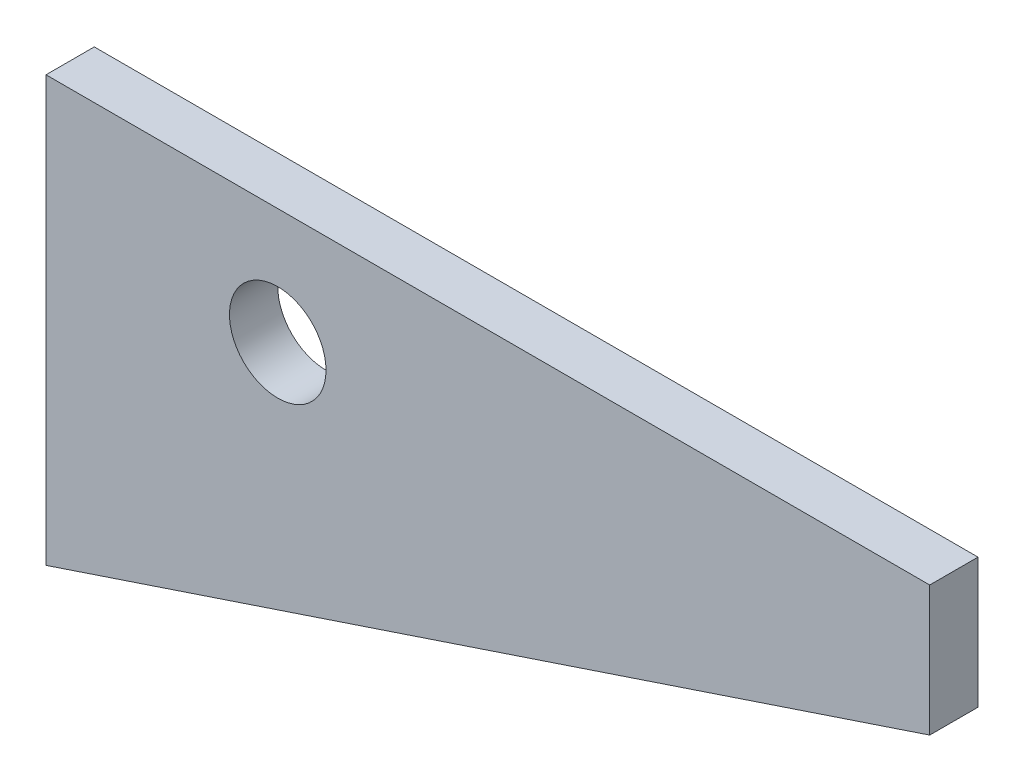
ISO-10303-21;
HEADER;
FILE_DESCRIPTION(('STEP AP214'),'2;1');
FILE_NAME('part.step','',(''),(''),'','','');
FILE_SCHEMA(('AUTOMOTIVE_DESIGN { 1 0 10303 214 1 1 1 1 }'));
ENDSEC;
DATA;
#1=APPLICATION_CONTEXT('core data for automotive mechanical design processes');
#2=APPLICATION_PROTOCOL_DEFINITION('international standard','automotive_design',2000,#1);
#3=PRODUCT_CONTEXT('',#1,'mechanical');
#4=PRODUCT('Part','Part','',(#3));
#5=PRODUCT_RELATED_PRODUCT_CATEGORY('part','',(#4));
#6=PRODUCT_DEFINITION_FORMATION('','',#4);
#7=PRODUCT_DEFINITION_CONTEXT('part definition',#1,'design');
#8=PRODUCT_DEFINITION('design','',#6,#7);
#9=PRODUCT_DEFINITION_SHAPE('','',#8);
#10=(LENGTH_UNIT() NAMED_UNIT(*) SI_UNIT(.MILLI.,.METRE.));
#11=(NAMED_UNIT(*) PLANE_ANGLE_UNIT() SI_UNIT($,.RADIAN.));
#12=(NAMED_UNIT(*) SI_UNIT($,.STERADIAN.) SOLID_ANGLE_UNIT());
#13=UNCERTAINTY_MEASURE_WITH_UNIT(LENGTH_MEASURE(1.E-05),#10,'distance_accuracy_value','');
#14=(GEOMETRIC_REPRESENTATION_CONTEXT(3) GLOBAL_UNCERTAINTY_ASSIGNED_CONTEXT((#13)) GLOBAL_UNIT_ASSIGNED_CONTEXT((#10,
#11,#12)) REPRESENTATION_CONTEXT('',''));
#15=CARTESIAN_POINT('',(0.,0.,0.));
#16=DIRECTION('',(0.,0.,1.));
#17=DIRECTION('',(1.,0.,0.));
#18=AXIS2_PLACEMENT_3D('',#15,#16,#17);
#19=CARTESIAN_POINT('',(0.,0.,7.9375));
#20=DIRECTION('',(0.,0.,-1.));
#21=DIRECTION('',(-1.,0.,0.));
#22=AXIS2_PLACEMENT_3D('',#19,#20,#21);
#23=PLANE('',#22);
#24=DIRECTION('',(0.,-1.,0.));
#25=VECTOR('',#24,1.);
#26=CARTESIAN_POINT('',(0.,-69.85,7.9375));
#27=LINE('',#26,#25);
#28=CARTESIAN_POINT('',(0.,0.,7.9375));
#29=VERTEX_POINT('',#28);
#30=CARTESIAN_POINT('',(0.,-69.85,7.9375));
#31=VERTEX_POINT('',#30);
#32=EDGE_CURVE('E92',#29,#31,#27,.T.);
#33=ORIENTED_EDGE('',*,*,#32,.T.);
#34=DIRECTION('',(0.948590381426202,0.31650637950236,0.));
#35=VECTOR('',#34,1.);
#36=CARTESIAN_POINT('',(145.288,-21.3732499026595,7.9375));
#37=LINE('',#36,#35);
#38=CARTESIAN_POINT('',(145.288,-21.3732499026595,7.9375));
#39=VERTEX_POINT('',#38);
#40=EDGE_CURVE('E87',#31,#39,#37,.T.);
#41=ORIENTED_EDGE('',*,*,#40,.T.);
#42=DIRECTION('',(0.,1.,0.));
#43=VECTOR('',#42,1.);
#44=CARTESIAN_POINT('',(145.288,0.,7.9375));
#45=LINE('',#44,#43);
#46=CARTESIAN_POINT('',(145.288,0.,7.9375));
#47=VERTEX_POINT('',#46);
#48=EDGE_CURVE('E90',#39,#47,#45,.T.);
#49=ORIENTED_EDGE('',*,*,#48,.T.);
#50=DIRECTION('',(-1.,0.,0.));
#51=VECTOR('',#50,1.);
#52=CARTESIAN_POINT('',(0.,0.,7.9375));
#53=LINE('',#52,#51);
#54=EDGE_CURVE('E57',#47,#29,#53,.T.);
#55=ORIENTED_EDGE('',*,*,#54,.T.);
#56=EDGE_LOOP('',(#33,#41,#49,#55));
#57=FACE_BOUND('',#56,.T.);
#58=CARTESIAN_POINT('',(38.1,-19.05,7.9375));
#59=DIRECTION('',(0.,0.,1.));
#60=DIRECTION('',(1.,0.,0.));
#61=AXIS2_PLACEMENT_3D('',#58,#59,#60);
#62=CIRCLE('',#61,7.9375);
#63=CARTESIAN_POINT('',(46.0375,-19.05,7.9375));
#64=VERTEX_POINT('',#63);
#65=EDGE_CURVE('E112',#64,#64,#62,.T.);
#66=ORIENTED_EDGE('',*,*,#65,.F.);
#67=EDGE_LOOP('',(#66));
#68=FACE_BOUND('',#67,.T.);
#69=ADVANCED_FACE('F39',(#57,#68),#23,.F.);
#70=CARTESIAN_POINT('',(0.,0.,0.));
#71=DIRECTION('',(0.,0.,-1.));
#72=DIRECTION('',(-1.,0.,0.));
#73=AXIS2_PLACEMENT_3D('',#70,#71,#72);
#74=PLANE('',#73);
#75=DIRECTION('',(0.,-1.,0.));
#76=VECTOR('',#75,1.);
#77=CARTESIAN_POINT('',(0.,-69.85,0.));
#78=LINE('',#77,#76);
#79=CARTESIAN_POINT('',(0.,0.,0.));
#80=VERTEX_POINT('',#79);
#81=CARTESIAN_POINT('',(0.,-69.85,0.));
#82=VERTEX_POINT('',#81);
#83=EDGE_CURVE('E108',#80,#82,#78,.T.);
#84=ORIENTED_EDGE('',*,*,#83,.F.);
#85=DIRECTION('',(-1.,0.,0.));
#86=VECTOR('',#85,1.);
#87=CARTESIAN_POINT('',(0.,0.,0.));
#88=LINE('',#87,#86);
#89=CARTESIAN_POINT('',(145.288,0.,0.));
#90=VERTEX_POINT('',#89);
#91=EDGE_CURVE('E80',#90,#80,#88,.T.);
#92=ORIENTED_EDGE('',*,*,#91,.F.);
#93=DIRECTION('',(0.,1.,0.));
#94=VECTOR('',#93,1.);
#95=CARTESIAN_POINT('',(145.288,0.,0.));
#96=LINE('',#95,#94);
#97=CARTESIAN_POINT('',(145.288,-21.3732499026595,0.));
#98=VERTEX_POINT('',#97);
#99=EDGE_CURVE('E74',#98,#90,#96,.T.);
#100=ORIENTED_EDGE('',*,*,#99,.F.);
#101=DIRECTION('',(0.948590381426202,0.31650637950236,0.));
#102=VECTOR('',#101,1.);
#103=CARTESIAN_POINT('',(145.288,-21.3732499026595,0.));
#104=LINE('',#103,#102);
#105=EDGE_CURVE('E97',#82,#98,#104,.T.);
#106=ORIENTED_EDGE('',*,*,#105,.F.);
#107=EDGE_LOOP('',(#84,#92,#100,#106));
#108=FACE_BOUND('',#107,.T.);
#109=CARTESIAN_POINT('',(38.1,-19.05,0.));
#110=DIRECTION('',(0.,0.,1.));
#111=DIRECTION('',(1.,0.,0.));
#112=AXIS2_PLACEMENT_3D('',#109,#110,#111);
#113=CIRCLE('',#112,7.9375);
#114=CARTESIAN_POINT('',(46.0375,-19.05,0.));
#115=VERTEX_POINT('',#114);
#116=EDGE_CURVE('E130',#115,#115,#113,.T.);
#117=ORIENTED_EDGE('',*,*,#116,.T.);
#118=EDGE_LOOP('',(#117));
#119=FACE_BOUND('',#118,.T.);
#120=ADVANCED_FACE('F125',(#108,#119),#74,.T.);
#121=CARTESIAN_POINT('',(0.,-69.85,7.9375));
#122=DIRECTION('',(1.,0.,0.));
#123=DIRECTION('',(0.,0.,-1.));
#124=AXIS2_PLACEMENT_3D('',#121,#122,#123);
#125=PLANE('',#124);
#126=ORIENTED_EDGE('',*,*,#83,.T.);
#127=DIRECTION('',(0.,0.,-1.));
#128=VECTOR('',#127,1.);
#129=CARTESIAN_POINT('',(0.,-69.85,7.9375));
#130=LINE('',#129,#128);
#131=EDGE_CURVE('E11',#31,#82,#130,.T.);
#132=ORIENTED_EDGE('',*,*,#131,.F.);
#133=ORIENTED_EDGE('',*,*,#32,.F.);
#134=DIRECTION('',(0.,0.,-1.));
#135=VECTOR('',#134,1.);
#136=CARTESIAN_POINT('',(0.,0.,7.9375));
#137=LINE('',#136,#135);
#138=EDGE_CURVE('E104',#29,#80,#137,.T.);
#139=ORIENTED_EDGE('',*,*,#138,.T.);
#140=EDGE_LOOP('',(#126,#132,#133,#139));
#141=FACE_BOUND('',#140,.T.);
#142=ADVANCED_FACE('F41',(#141),#125,.F.);
#143=CARTESIAN_POINT('',(145.288,-21.3732499026595,7.9375));
#144=DIRECTION('',(-0.31650637950236,0.948590381426202,0.));
#145=DIRECTION('',(-0.948590381426202,-0.31650637950236,0.));
#146=AXIS2_PLACEMENT_3D('',#143,#144,#145);
#147=PLANE('',#146);
#148=ORIENTED_EDGE('',*,*,#105,.T.);
#149=DIRECTION('',(0.,0.,-1.));
#150=VECTOR('',#149,1.);
#151=CARTESIAN_POINT('',(145.288,-21.3732499026595,7.9375));
#152=LINE('',#151,#150);
#153=EDGE_CURVE('E49',#39,#98,#152,.T.);
#154=ORIENTED_EDGE('',*,*,#153,.F.);
#155=ORIENTED_EDGE('',*,*,#40,.F.);
#156=ORIENTED_EDGE('',*,*,#131,.T.);
#157=EDGE_LOOP('',(#148,#154,#155,#156));
#158=FACE_BOUND('',#157,.T.);
#159=ADVANCED_FACE('F96',(#158),#147,.F.);
#160=CARTESIAN_POINT('',(145.288,0.,7.9375));
#161=DIRECTION('',(-1.,0.,0.));
#162=DIRECTION('',(0.,0.,1.));
#163=AXIS2_PLACEMENT_3D('',#160,#161,#162);
#164=PLANE('',#163);
#165=ORIENTED_EDGE('',*,*,#99,.T.);
#166=DIRECTION('',(0.,0.,-1.));
#167=VECTOR('',#166,1.);
#168=CARTESIAN_POINT('',(145.288,0.,7.9375));
#169=LINE('',#168,#167);
#170=EDGE_CURVE('E99',#47,#90,#169,.T.);
#171=ORIENTED_EDGE('',*,*,#170,.F.);
#172=ORIENTED_EDGE('',*,*,#48,.F.);
#173=ORIENTED_EDGE('',*,*,#153,.T.);
#174=EDGE_LOOP('',(#165,#171,#172,#173));
#175=FACE_BOUND('',#174,.T.);
#176=ADVANCED_FACE('F100',(#175),#164,.F.);
#177=CARTESIAN_POINT('',(0.,0.,7.9375));
#178=DIRECTION('',(0.,-1.,0.));
#179=DIRECTION('',(0.,0.,-1.));
#180=AXIS2_PLACEMENT_3D('',#177,#178,#179);
#181=PLANE('',#180);
#182=ORIENTED_EDGE('',*,*,#91,.T.);
#183=ORIENTED_EDGE('',*,*,#138,.F.);
#184=ORIENTED_EDGE('',*,*,#54,.F.);
#185=ORIENTED_EDGE('',*,*,#170,.T.);
#186=EDGE_LOOP('',(#182,#183,#184,#185));
#187=FACE_BOUND('',#186,.T.);
#188=ADVANCED_FACE('F122',(#187),#181,.F.);
#189=CARTESIAN_POINT('',(38.1,-19.05,7.9375));
#190=DIRECTION('',(0.,0.,-1.));
#191=DIRECTION('',(-1.,0.,0.));
#192=AXIS2_PLACEMENT_3D('',#189,#190,#191);
#193=CYLINDRICAL_SURFACE('',#192,7.9375);
#194=ORIENTED_EDGE('',*,*,#65,.T.);
#195=EDGE_LOOP('',(#194));
#196=FACE_BOUND('',#195,.T.);
#197=ORIENTED_EDGE('',*,*,#116,.F.);
#198=EDGE_LOOP('',(#197));
#199=FACE_BOUND('',#198,.T.);
#200=ADVANCED_FACE('F138',(#196,#199),#193,.F.);
#201=CLOSED_SHELL('',(#69,#120,#142,#159,#176,#188,#200));
#202=MANIFOLD_SOLID_BREP('B2',#201);
#203=ADVANCED_BREP_SHAPE_REPRESENTATION('',(#18,#202),#14);
#204=SHAPE_DEFINITION_REPRESENTATION(#9,#203);
ENDSEC;
END-ISO-10303-21;
